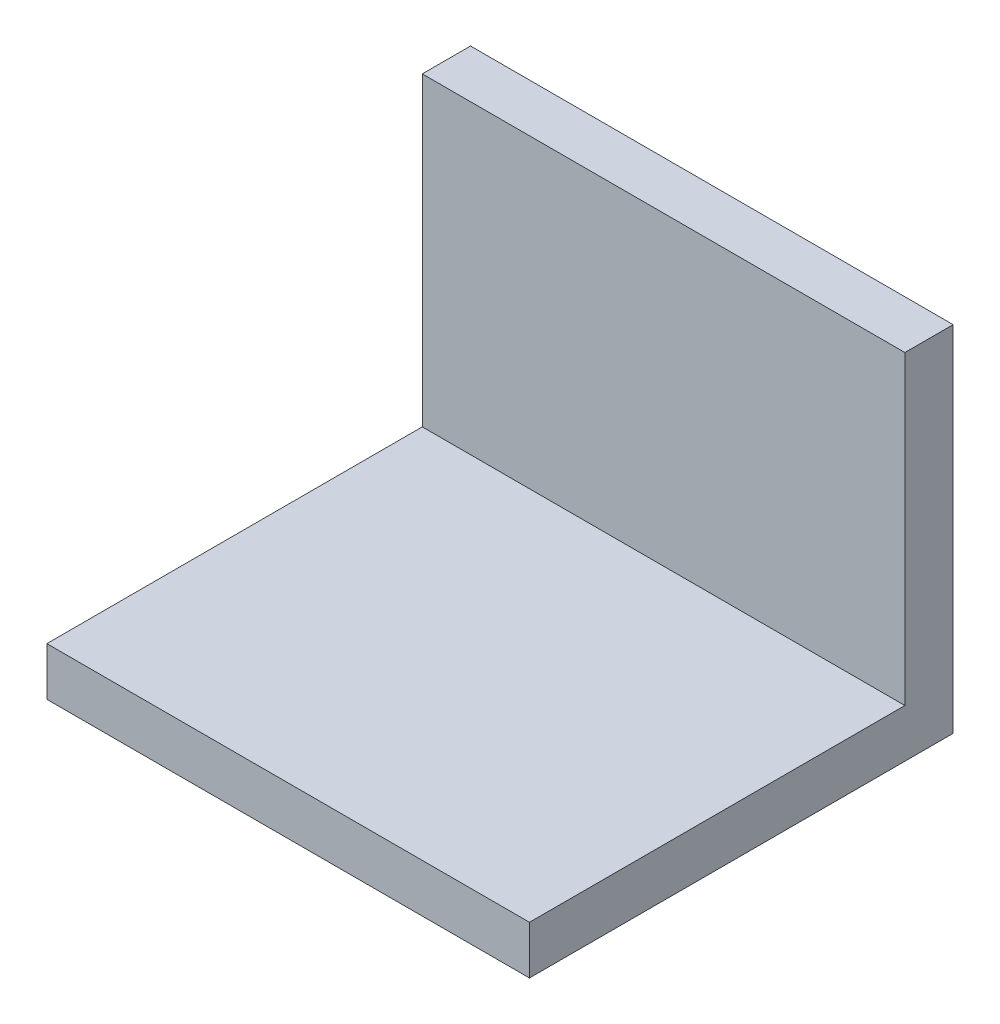
ISO-10303-21;
HEADER;
FILE_DESCRIPTION(('STEP AP214'),'2;1');
FILE_NAME('part.step','',(''),(''),'','','');
FILE_SCHEMA(('AUTOMOTIVE_DESIGN { 1 0 10303 214 1 1 1 1 }'));
ENDSEC;
DATA;
#1=APPLICATION_CONTEXT('core data for automotive mechanical design processes');
#2=APPLICATION_PROTOCOL_DEFINITION('international standard','automotive_design',2000,#1);
#3=PRODUCT_CONTEXT('',#1,'mechanical');
#4=PRODUCT('Part','Part','',(#3));
#5=PRODUCT_RELATED_PRODUCT_CATEGORY('part','',(#4));
#6=PRODUCT_DEFINITION_FORMATION('','',#4);
#7=PRODUCT_DEFINITION_CONTEXT('part definition',#1,'design');
#8=PRODUCT_DEFINITION('design','',#6,#7);
#9=PRODUCT_DEFINITION_SHAPE('','',#8);
#10=(LENGTH_UNIT() NAMED_UNIT(*) SI_UNIT(.MILLI.,.METRE.));
#11=(NAMED_UNIT(*) PLANE_ANGLE_UNIT() SI_UNIT($,.RADIAN.));
#12=(NAMED_UNIT(*) SI_UNIT($,.STERADIAN.) SOLID_ANGLE_UNIT());
#13=UNCERTAINTY_MEASURE_WITH_UNIT(LENGTH_MEASURE(1.E-05),#10,'distance_accuracy_value','');
#14=(GEOMETRIC_REPRESENTATION_CONTEXT(3) GLOBAL_UNCERTAINTY_ASSIGNED_CONTEXT((#13)) GLOBAL_UNIT_ASSIGNED_CONTEXT((#10,
#11,#12)) REPRESENTATION_CONTEXT('',''));
#15=CARTESIAN_POINT('',(0.,0.,0.));
#16=DIRECTION('',(0.,0.,1.));
#17=DIRECTION('',(1.,0.,0.));
#18=AXIS2_PLACEMENT_3D('',#15,#16,#17);
#19=CARTESIAN_POINT('',(-76.2,7.62,0.));
#20=DIRECTION('',(0.,0.,1.));
#21=DIRECTION('',(0.,-1.,0.));
#22=AXIS2_PLACEMENT_3D('',#19,#20,#21);
#23=PLANE('',#22);
#24=DIRECTION('',(0.,-1.,0.));
#25=VECTOR('',#24,1.);
#26=CARTESIAN_POINT('',(0.,7.62,0.));
#27=LINE('',#26,#25);
#28=CARTESIAN_POINT('',(0.,7.62,0.));
#29=VERTEX_POINT('',#28);
#30=CARTESIAN_POINT('',(0.,0.,0.));
#31=VERTEX_POINT('',#30);
#32=EDGE_CURVE('E115',#29,#31,#27,.T.);
#33=ORIENTED_EDGE('',*,*,#32,.F.);
#34=DIRECTION('',(1.,0.,0.));
#35=VECTOR('',#34,1.);
#36=CARTESIAN_POINT('',(-76.2,7.62,0.));
#37=LINE('',#36,#35);
#38=CARTESIAN_POINT('',(-76.2,7.62,0.));
#39=VERTEX_POINT('',#38);
#40=EDGE_CURVE('E11',#39,#29,#37,.T.);
#41=ORIENTED_EDGE('',*,*,#40,.F.);
#42=DIRECTION('',(0.,-1.,0.));
#43=VECTOR('',#42,1.);
#44=CARTESIAN_POINT('',(-76.2,7.62,0.));
#45=LINE('',#44,#43);
#46=CARTESIAN_POINT('',(-76.2,0.,0.));
#47=VERTEX_POINT('',#46);
#48=EDGE_CURVE('E129',#39,#47,#45,.T.);
#49=ORIENTED_EDGE('',*,*,#48,.T.);
#50=DIRECTION('',(1.,0.,0.));
#51=VECTOR('',#50,1.);
#52=CARTESIAN_POINT('',(-76.2,0.,0.));
#53=LINE('',#52,#51);
#54=EDGE_CURVE('E33',#47,#31,#53,.T.);
#55=ORIENTED_EDGE('',*,*,#54,.T.);
#56=EDGE_LOOP('',(#33,#41,#49,#55));
#57=FACE_BOUND('',#56,.T.);
#58=ADVANCED_FACE('F30',(#57),#23,.T.);
#59=CARTESIAN_POINT('',(-76.2,7.62000000000001,-59.2739513263459));
#60=DIRECTION('',(0.,1.,0.));
#61=DIRECTION('',(0.,0.,1.));
#62=AXIS2_PLACEMENT_3D('',#59,#60,#61);
#63=PLANE('',#62);
#64=DIRECTION('',(0.,0.,1.));
#65=VECTOR('',#64,1.);
#66=CARTESIAN_POINT('',(0.,7.62000000000001,-59.2739513263459));
#67=LINE('',#66,#65);
#68=CARTESIAN_POINT('',(0.,7.62000000000001,-59.2739513263459));
#69=VERTEX_POINT('',#68);
#70=EDGE_CURVE('E127',#69,#29,#67,.T.);
#71=ORIENTED_EDGE('',*,*,#70,.F.);
#72=DIRECTION('',(1.,0.,0.));
#73=VECTOR('',#72,1.);
#74=CARTESIAN_POINT('',(-76.2,7.62000000000001,-59.2739513263459));
#75=LINE('',#74,#73);
#76=CARTESIAN_POINT('',(-76.2,7.62000000000001,-59.2739513263459));
#77=VERTEX_POINT('',#76);
#78=EDGE_CURVE('E39',#77,#69,#75,.T.);
#79=ORIENTED_EDGE('',*,*,#78,.F.);
#80=DIRECTION('',(0.,0.,1.));
#81=VECTOR('',#80,1.);
#82=CARTESIAN_POINT('',(-76.2,7.62000000000001,-59.2739513263459));
#83=LINE('',#82,#81);
#84=EDGE_CURVE('E105',#77,#39,#83,.T.);
#85=ORIENTED_EDGE('',*,*,#84,.T.);
#86=ORIENTED_EDGE('',*,*,#40,.T.);
#87=EDGE_LOOP('',(#71,#79,#85,#86));
#88=FACE_BOUND('',#87,.T.);
#89=ADVANCED_FACE('F137',(#88),#63,.T.);
#90=CARTESIAN_POINT('',(-76.2,55.8859317943102,-59.2739513263459));
#91=DIRECTION('',(0.,0.,1.));
#92=DIRECTION('',(0.,-1.,0.));
#93=AXIS2_PLACEMENT_3D('',#90,#91,#92);
#94=PLANE('',#93);
#95=DIRECTION('',(0.,-1.,0.));
#96=VECTOR('',#95,1.);
#97=CARTESIAN_POINT('',(0.,55.8859317943102,-59.2739513263459));
#98=LINE('',#97,#96);
#99=CARTESIAN_POINT('',(0.,55.8859317943102,-59.2739513263459));
#100=VERTEX_POINT('',#99);
#101=EDGE_CURVE('E92',#100,#69,#98,.T.);
#102=ORIENTED_EDGE('',*,*,#101,.F.);
#103=DIRECTION('',(1.,0.,0.));
#104=VECTOR('',#103,1.);
#105=CARTESIAN_POINT('',(-76.2,55.8859317943102,-59.2739513263459));
#106=LINE('',#105,#104);
#107=CARTESIAN_POINT('',(-76.2,55.8859317943102,-59.2739513263459));
#108=VERTEX_POINT('',#107);
#109=EDGE_CURVE('E87',#108,#100,#106,.T.);
#110=ORIENTED_EDGE('',*,*,#109,.F.);
#111=DIRECTION('',(0.,-1.,0.));
#112=VECTOR('',#111,1.);
#113=CARTESIAN_POINT('',(-76.2,55.8859317943102,-59.2739513263459));
#114=LINE('',#113,#112);
#115=EDGE_CURVE('E90',#108,#77,#114,.T.);
#116=ORIENTED_EDGE('',*,*,#115,.T.);
#117=ORIENTED_EDGE('',*,*,#78,.T.);
#118=EDGE_LOOP('',(#102,#110,#116,#117));
#119=FACE_BOUND('',#118,.T.);
#120=ADVANCED_FACE('F89',(#119),#94,.T.);
#121=CARTESIAN_POINT('',(-76.2,55.8859317943102,-66.8939513263459));
#122=DIRECTION('',(0.,1.,0.));
#123=DIRECTION('',(0.,0.,1.));
#124=AXIS2_PLACEMENT_3D('',#121,#122,#123);
#125=PLANE('',#124);
#126=DIRECTION('',(0.,0.,1.));
#127=VECTOR('',#126,1.);
#128=CARTESIAN_POINT('',(0.,55.8859317943102,-66.8939513263459));
#129=LINE('',#128,#127);
#130=CARTESIAN_POINT('',(0.,55.8859317943102,-66.8939513263459));
#131=VERTEX_POINT('',#130);
#132=EDGE_CURVE('E124',#131,#100,#129,.T.);
#133=ORIENTED_EDGE('',*,*,#132,.F.);
#134=DIRECTION('',(1.,0.,0.));
#135=VECTOR('',#134,1.);
#136=CARTESIAN_POINT('',(-76.2,55.8859317943102,-66.8939513263459));
#137=LINE('',#136,#135);
#138=CARTESIAN_POINT('',(-76.2,55.8859317943102,-66.8939513263459));
#139=VERTEX_POINT('',#138);
#140=EDGE_CURVE('E97',#139,#131,#137,.T.);
#141=ORIENTED_EDGE('',*,*,#140,.F.);
#142=DIRECTION('',(0.,0.,1.));
#143=VECTOR('',#142,1.);
#144=CARTESIAN_POINT('',(-76.2,55.8859317943102,-66.8939513263459));
#145=LINE('',#144,#143);
#146=EDGE_CURVE('E103',#139,#108,#145,.T.);
#147=ORIENTED_EDGE('',*,*,#146,.T.);
#148=ORIENTED_EDGE('',*,*,#109,.T.);
#149=EDGE_LOOP('',(#133,#141,#147,#148));
#150=FACE_BOUND('',#149,.T.);
#151=ADVANCED_FACE('F107',(#150),#125,.T.);
#152=CARTESIAN_POINT('',(-76.2,0.,-66.8939513263459));
#153=DIRECTION('',(0.,0.,-1.));
#154=DIRECTION('',(-1.,0.,0.));
#155=AXIS2_PLACEMENT_3D('',#152,#153,#154);
#156=PLANE('',#155);
#157=DIRECTION('',(0.,1.,0.));
#158=VECTOR('',#157,1.);
#159=CARTESIAN_POINT('',(0.,0.,-66.8939513263459));
#160=LINE('',#159,#158);
#161=CARTESIAN_POINT('',(0.,0.,-66.8939513263459));
#162=VERTEX_POINT('',#161);
#163=EDGE_CURVE('E121',#162,#131,#160,.T.);
#164=ORIENTED_EDGE('',*,*,#163,.F.);
#165=DIRECTION('',(1.,0.,0.));
#166=VECTOR('',#165,1.);
#167=CARTESIAN_POINT('',(-76.2,0.,-66.8939513263459));
#168=LINE('',#167,#166);
#169=CARTESIAN_POINT('',(-76.2,0.,-66.8939513263459));
#170=VERTEX_POINT('',#169);
#171=EDGE_CURVE('E132',#170,#162,#168,.T.);
#172=ORIENTED_EDGE('',*,*,#171,.F.);
#173=DIRECTION('',(0.,1.,0.));
#174=VECTOR('',#173,1.);
#175=CARTESIAN_POINT('',(-76.2,0.,-66.8939513263459));
#176=LINE('',#175,#174);
#177=EDGE_CURVE('E108',#170,#139,#176,.T.);
#178=ORIENTED_EDGE('',*,*,#177,.T.);
#179=ORIENTED_EDGE('',*,*,#140,.T.);
#180=EDGE_LOOP('',(#164,#172,#178,#179));
#181=FACE_BOUND('',#180,.T.);
#182=ADVANCED_FACE('F150',(#181),#156,.T.);
#183=CARTESIAN_POINT('',(-76.2,0.,0.));
#184=DIRECTION('',(0.,-1.,0.));
#185=DIRECTION('',(0.,0.,-1.));
#186=AXIS2_PLACEMENT_3D('',#183,#184,#185);
#187=PLANE('',#186);
#188=DIRECTION('',(0.,0.,-1.));
#189=VECTOR('',#188,1.);
#190=CARTESIAN_POINT('',(0.,0.,0.));
#191=LINE('',#190,#189);
#192=EDGE_CURVE('E118',#31,#162,#191,.T.);
#193=ORIENTED_EDGE('',*,*,#192,.F.);
#194=ORIENTED_EDGE('',*,*,#54,.F.);
#195=DIRECTION('',(0.,0.,-1.));
#196=VECTOR('',#195,1.);
#197=CARTESIAN_POINT('',(-76.2,0.,0.));
#198=LINE('',#197,#196);
#199=EDGE_CURVE('E110',#47,#170,#198,.T.);
#200=ORIENTED_EDGE('',*,*,#199,.T.);
#201=ORIENTED_EDGE('',*,*,#171,.T.);
#202=EDGE_LOOP('',(#193,#194,#200,#201));
#203=FACE_BOUND('',#202,.T.);
#204=ADVANCED_FACE('F134',(#203),#187,.T.);
#205=CARTESIAN_POINT('',(-76.2,0.,0.));
#206=DIRECTION('',(1.,0.,0.));
#207=DIRECTION('',(0.,0.,-1.));
#208=AXIS2_PLACEMENT_3D('',#205,#206,#207);
#209=PLANE('',#208);
#210=ORIENTED_EDGE('',*,*,#48,.F.);
#211=ORIENTED_EDGE('',*,*,#84,.F.);
#212=ORIENTED_EDGE('',*,*,#115,.F.);
#213=ORIENTED_EDGE('',*,*,#146,.F.);
#214=ORIENTED_EDGE('',*,*,#177,.F.);
#215=ORIENTED_EDGE('',*,*,#199,.F.);
#216=EDGE_LOOP('',(#210,#211,#212,#213,#214,#215));
#217=FACE_BOUND('',#216,.T.);
#218=ADVANCED_FACE('F101',(#217),#209,.F.);
#219=CARTESIAN_POINT('',(0.,0.,0.));
#220=DIRECTION('',(1.,0.,0.));
#221=DIRECTION('',(0.,0.,-1.));
#222=AXIS2_PLACEMENT_3D('',#219,#220,#221);
#223=PLANE('',#222);
#224=ORIENTED_EDGE('',*,*,#32,.T.);
#225=ORIENTED_EDGE('',*,*,#192,.T.);
#226=ORIENTED_EDGE('',*,*,#163,.T.);
#227=ORIENTED_EDGE('',*,*,#132,.T.);
#228=ORIENTED_EDGE('',*,*,#101,.T.);
#229=ORIENTED_EDGE('',*,*,#70,.T.);
#230=EDGE_LOOP('',(#224,#225,#226,#227,#228,#229));
#231=FACE_BOUND('',#230,.T.);
#232=ADVANCED_FACE('F136',(#231),#223,.T.);
#233=CLOSED_SHELL('',(#58,#89,#120,#151,#182,#204,#218,#232));
#234=MANIFOLD_SOLID_BREP('B2',#233);
#235=ADVANCED_BREP_SHAPE_REPRESENTATION('',(#18,#234),#14);
#236=SHAPE_DEFINITION_REPRESENTATION(#9,#235);
ENDSEC;
END-ISO-10303-21;
